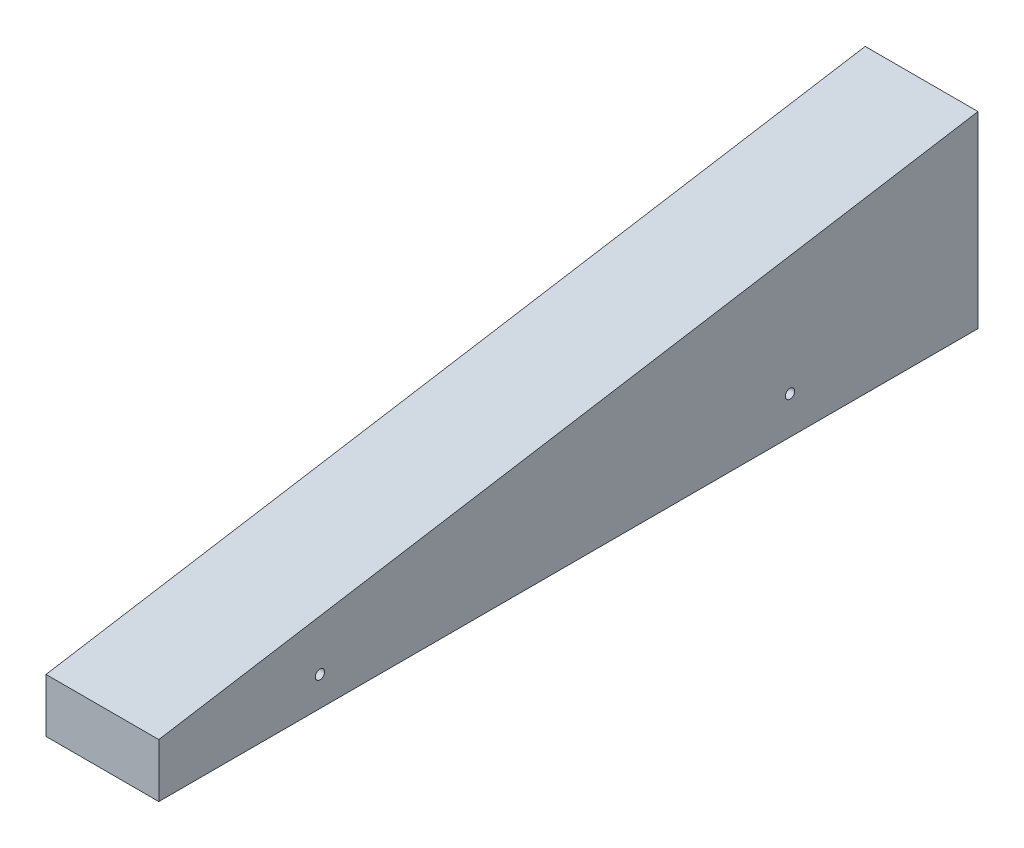
ISO-10303-21;
HEADER;
FILE_DESCRIPTION(('STEP AP214'),'2;1');
FILE_NAME('part.step','',(''),(''),'','','');
FILE_SCHEMA(('AUTOMOTIVE_DESIGN { 1 0 10303 214 1 1 1 1 }'));
ENDSEC;
DATA;
#1=APPLICATION_CONTEXT('core data for automotive mechanical design processes');
#2=APPLICATION_PROTOCOL_DEFINITION('international standard','automotive_design',2000,#1);
#3=PRODUCT_CONTEXT('',#1,'mechanical');
#4=PRODUCT('Part','Part','',(#3));
#5=PRODUCT_RELATED_PRODUCT_CATEGORY('part','',(#4));
#6=PRODUCT_DEFINITION_FORMATION('','',#4);
#7=PRODUCT_DEFINITION_CONTEXT('part definition',#1,'design');
#8=PRODUCT_DEFINITION('design','',#6,#7);
#9=PRODUCT_DEFINITION_SHAPE('','',#8);
#10=(LENGTH_UNIT() NAMED_UNIT(*) SI_UNIT(.MILLI.,.METRE.));
#11=(NAMED_UNIT(*) PLANE_ANGLE_UNIT() SI_UNIT($,.RADIAN.));
#12=(NAMED_UNIT(*) SI_UNIT($,.STERADIAN.) SOLID_ANGLE_UNIT());
#13=UNCERTAINTY_MEASURE_WITH_UNIT(LENGTH_MEASURE(1.E-05),#10,'distance_accuracy_value','');
#14=(GEOMETRIC_REPRESENTATION_CONTEXT(3) GLOBAL_UNCERTAINTY_ASSIGNED_CONTEXT((#13)) GLOBAL_UNIT_ASSIGNED_CONTEXT((#10,
#11,#12)) REPRESENTATION_CONTEXT('',''));
#15=CARTESIAN_POINT('',(0.,0.,0.));
#16=DIRECTION('',(0.,0.,1.));
#17=DIRECTION('',(1.,0.,0.));
#18=AXIS2_PLACEMENT_3D('',#15,#16,#17);
#19=CARTESIAN_POINT('',(21.,0.,152.5));
#20=DIRECTION('',(0.,0.,-1.));
#21=DIRECTION('',(-1.,0.,0.));
#22=AXIS2_PLACEMENT_3D('',#19,#20,#21);
#23=PLANE('',#22);
#24=DIRECTION('',(0.,-1.,0.));
#25=VECTOR('',#24,1.);
#26=CARTESIAN_POINT('',(-21.,0.,152.5));
#27=LINE('',#26,#25);
#28=CARTESIAN_POINT('',(-21.,20.,152.5));
#29=VERTEX_POINT('',#28);
#30=CARTESIAN_POINT('',(-21.,0.,152.5));
#31=VERTEX_POINT('',#30);
#32=EDGE_CURVE('E95',#29,#31,#27,.T.);
#33=ORIENTED_EDGE('',*,*,#32,.T.);
#34=DIRECTION('',(-1.,0.,0.));
#35=VECTOR('',#34,1.);
#36=CARTESIAN_POINT('',(21.,0.,152.5));
#37=LINE('',#36,#35);
#38=CARTESIAN_POINT('',(21.,0.,152.5));
#39=VERTEX_POINT('',#38);
#40=EDGE_CURVE('E11',#39,#31,#37,.T.);
#41=ORIENTED_EDGE('',*,*,#40,.F.);
#42=DIRECTION('',(0.,-1.,0.));
#43=VECTOR('',#42,1.);
#44=CARTESIAN_POINT('',(21.,0.,152.5));
#45=LINE('',#44,#43);
#46=CARTESIAN_POINT('',(21.,20.,152.5));
#47=VERTEX_POINT('',#46);
#48=EDGE_CURVE('E83',#47,#39,#45,.T.);
#49=ORIENTED_EDGE('',*,*,#48,.F.);
#50=DIRECTION('',(-1.,0.,0.));
#51=VECTOR('',#50,1.);
#52=CARTESIAN_POINT('',(21.,20.,152.5));
#53=LINE('',#52,#51);
#54=EDGE_CURVE('E91',#47,#29,#53,.T.);
#55=ORIENTED_EDGE('',*,*,#54,.T.);
#56=EDGE_LOOP('',(#33,#41,#49,#55));
#57=FACE_BOUND('',#56,.T.);
#58=ADVANCED_FACE('F32',(#57),#23,.F.);
#59=CARTESIAN_POINT('',(21.,0.,152.5));
#60=DIRECTION('',(0.,1.,0.));
#61=DIRECTION('',(0.,0.,1.));
#62=AXIS2_PLACEMENT_3D('',#59,#60,#61);
#63=PLANE('',#62);
#64=DIRECTION('',(0.,0.,-1.));
#65=VECTOR('',#64,1.);
#66=CARTESIAN_POINT('',(-21.,0.,152.5));
#67=LINE('',#66,#65);
#68=CARTESIAN_POINT('',(-21.,0.,-152.5));
#69=VERTEX_POINT('',#68);
#70=EDGE_CURVE('E87',#31,#69,#67,.T.);
#71=ORIENTED_EDGE('',*,*,#70,.T.);
#72=DIRECTION('',(-1.,0.,0.));
#73=VECTOR('',#72,1.);
#74=CARTESIAN_POINT('',(21.,0.,-152.5));
#75=LINE('',#74,#73);
#76=CARTESIAN_POINT('',(21.,0.,-152.5));
#77=VERTEX_POINT('',#76);
#78=EDGE_CURVE('E40',#77,#69,#75,.T.);
#79=ORIENTED_EDGE('',*,*,#78,.F.);
#80=DIRECTION('',(0.,0.,-1.));
#81=VECTOR('',#80,1.);
#82=CARTESIAN_POINT('',(21.,0.,152.5));
#83=LINE('',#82,#81);
#84=EDGE_CURVE('E78',#39,#77,#83,.T.);
#85=ORIENTED_EDGE('',*,*,#84,.F.);
#86=ORIENTED_EDGE('',*,*,#40,.T.);
#87=EDGE_LOOP('',(#71,#79,#85,#86));
#88=FACE_BOUND('',#87,.T.);
#89=ADVANCED_FACE('F86',(#88),#63,.F.);
#90=CARTESIAN_POINT('',(21.,0.,-152.5));
#91=DIRECTION('',(0.,0.,1.));
#92=DIRECTION('',(1.,0.,0.));
#93=AXIS2_PLACEMENT_3D('',#90,#91,#92);
#94=PLANE('',#93);
#95=CARTESIAN_POINT('',(0.,32.,-152.5));
#96=DIRECTION('',(0.,0.,-1.));
#97=DIRECTION('',(-1.,0.,0.));
#98=AXIS2_PLACEMENT_3D('',#95,#96,#97);
#99=CIRCLE('',#98,10.);
#100=CARTESIAN_POINT('',(-10.,32.,-152.5));
#101=VERTEX_POINT('',#100);
#102=EDGE_CURVE('E109',#101,#101,#99,.T.);
#103=ORIENTED_EDGE('',*,*,#102,.F.);
#104=EDGE_LOOP('',(#103));
#105=FACE_BOUND('',#104,.T.);
#106=DIRECTION('',(0.,1.,0.));
#107=VECTOR('',#106,1.);
#108=CARTESIAN_POINT('',(-21.,0.,-152.5));
#109=LINE('',#108,#107);
#110=CARTESIAN_POINT('',(-21.,70.,-152.5));
#111=VERTEX_POINT('',#110);
#112=EDGE_CURVE('E65',#69,#111,#109,.T.);
#113=ORIENTED_EDGE('',*,*,#112,.T.);
#114=DIRECTION('',(-1.,0.,0.));
#115=VECTOR('',#114,1.);
#116=CARTESIAN_POINT('',(21.,70.,-152.5));
#117=LINE('',#116,#115);
#118=CARTESIAN_POINT('',(21.,70.,-152.5));
#119=VERTEX_POINT('',#118);
#120=EDGE_CURVE('E88',#119,#111,#117,.T.);
#121=ORIENTED_EDGE('',*,*,#120,.F.);
#122=DIRECTION('',(0.,1.,0.));
#123=VECTOR('',#122,1.);
#124=CARTESIAN_POINT('',(21.,0.,-152.5));
#125=LINE('',#124,#123);
#126=EDGE_CURVE('E81',#77,#119,#125,.T.);
#127=ORIENTED_EDGE('',*,*,#126,.F.);
#128=ORIENTED_EDGE('',*,*,#78,.T.);
#129=EDGE_LOOP('',(#113,#121,#127,#128));
#130=FACE_BOUND('',#129,.T.);
#131=ADVANCED_FACE('F89',(#105,#130),#94,.F.);
#132=CARTESIAN_POINT('',(21.,20.,152.5));
#133=DIRECTION('',(0.,-0.986827665105534,-0.161775027066481));
#134=DIRECTION('',(0.,0.161775027066481,-0.986827665105534));
#135=AXIS2_PLACEMENT_3D('',#132,#133,#134);
#136=PLANE('',#135);
#137=DIRECTION('',(0.,-0.161775027066481,0.986827665105534));
#138=VECTOR('',#137,1.);
#139=CARTESIAN_POINT('',(-21.,20.,152.5));
#140=LINE('',#139,#138);
#141=EDGE_CURVE('E71',#111,#29,#140,.T.);
#142=ORIENTED_EDGE('',*,*,#141,.T.);
#143=ORIENTED_EDGE('',*,*,#54,.F.);
#144=DIRECTION('',(0.,-0.161775027066481,0.986827665105534));
#145=VECTOR('',#144,1.);
#146=CARTESIAN_POINT('',(21.,20.,152.5));
#147=LINE('',#146,#145);
#148=EDGE_CURVE('E48',#119,#47,#147,.T.);
#149=ORIENTED_EDGE('',*,*,#148,.F.);
#150=ORIENTED_EDGE('',*,*,#120,.T.);
#151=EDGE_LOOP('',(#142,#143,#149,#150));
#152=FACE_BOUND('',#151,.T.);
#153=ADVANCED_FACE('F103',(#152),#136,.F.);
#154=CARTESIAN_POINT('',(21.,0.,152.5));
#155=DIRECTION('',(-1.,0.,0.));
#156=DIRECTION('',(0.,0.,1.));
#157=AXIS2_PLACEMENT_3D('',#154,#155,#156);
#158=PLANE('',#157);
#159=CARTESIAN_POINT('',(21.,14.,-82.5));
#160=DIRECTION('',(1.,0.,0.));
#161=DIRECTION('',(0.,0.,-1.));
#162=AXIS2_PLACEMENT_3D('',#159,#160,#161);
#163=CIRCLE('',#162,1.75);
#164=CARTESIAN_POINT('',(21.,14.,-84.25));
#165=VERTEX_POINT('',#164);
#166=EDGE_CURVE('E123',#165,#165,#163,.T.);
#167=ORIENTED_EDGE('',*,*,#166,.F.);
#168=EDGE_LOOP('',(#167));
#169=FACE_BOUND('',#168,.T.);
#170=CARTESIAN_POINT('',(21.,11.,92.5));
#171=DIRECTION('',(1.,0.,0.));
#172=DIRECTION('',(0.,0.,-1.));
#173=AXIS2_PLACEMENT_3D('',#170,#171,#172);
#174=CIRCLE('',#173,1.75);
#175=CARTESIAN_POINT('',(21.,11.,90.75));
#176=VERTEX_POINT('',#175);
#177=EDGE_CURVE('E117',#176,#176,#174,.T.);
#178=ORIENTED_EDGE('',*,*,#177,.F.);
#179=EDGE_LOOP('',(#178));
#180=FACE_BOUND('',#179,.T.);
#181=ORIENTED_EDGE('',*,*,#48,.T.);
#182=ORIENTED_EDGE('',*,*,#84,.T.);
#183=ORIENTED_EDGE('',*,*,#126,.T.);
#184=ORIENTED_EDGE('',*,*,#148,.T.);
#185=EDGE_LOOP('',(#181,#182,#183,#184));
#186=FACE_BOUND('',#185,.T.);
#187=ADVANCED_FACE('F79',(#169,#180,#186),#158,.F.);
#188=CARTESIAN_POINT('',(-21.,0.,152.5));
#189=DIRECTION('',(-1.,0.,0.));
#190=DIRECTION('',(0.,0.,1.));
#191=AXIS2_PLACEMENT_3D('',#188,#189,#190);
#192=PLANE('',#191);
#193=CARTESIAN_POINT('',(-21.,14.,-82.5));
#194=DIRECTION('',(1.,0.,0.));
#195=DIRECTION('',(0.,0.,-1.));
#196=AXIS2_PLACEMENT_3D('',#193,#194,#195);
#197=CIRCLE('',#196,1.75);
#198=CARTESIAN_POINT('',(-21.,14.,-84.25));
#199=VERTEX_POINT('',#198);
#200=EDGE_CURVE('E120',#199,#199,#197,.T.);
#201=ORIENTED_EDGE('',*,*,#200,.T.);
#202=EDGE_LOOP('',(#201));
#203=FACE_BOUND('',#202,.T.);
#204=CARTESIAN_POINT('',(-21.,11.,92.5));
#205=DIRECTION('',(1.,0.,0.));
#206=DIRECTION('',(0.,0.,-1.));
#207=AXIS2_PLACEMENT_3D('',#204,#205,#206);
#208=CIRCLE('',#207,1.75);
#209=CARTESIAN_POINT('',(-21.,11.,90.75));
#210=VERTEX_POINT('',#209);
#211=EDGE_CURVE('E112',#210,#210,#208,.T.);
#212=ORIENTED_EDGE('',*,*,#211,.T.);
#213=EDGE_LOOP('',(#212));
#214=FACE_BOUND('',#213,.T.);
#215=ORIENTED_EDGE('',*,*,#32,.F.);
#216=ORIENTED_EDGE('',*,*,#141,.F.);
#217=ORIENTED_EDGE('',*,*,#112,.F.);
#218=ORIENTED_EDGE('',*,*,#70,.F.);
#219=EDGE_LOOP('',(#215,#216,#217,#218));
#220=FACE_BOUND('',#219,.T.);
#221=ADVANCED_FACE('F106',(#203,#214,#220),#192,.T.);
#222=CARTESIAN_POINT('',(0.,32.,-101.5));
#223=DIRECTION('',(0.,0.,-1.));
#224=DIRECTION('',(-1.,0.,0.));
#225=AXIS2_PLACEMENT_3D('',#222,#223,#224);
#226=CYLINDRICAL_SURFACE('',#225,10.);
#227=CARTESIAN_POINT('',(0.,32.,-101.5));
#228=DIRECTION('',(0.,0.,-1.));
#229=DIRECTION('',(-1.,0.,0.));
#230=AXIS2_PLACEMENT_3D('',#227,#228,#229);
#231=CIRCLE('',#230,10.);
#232=CARTESIAN_POINT('',(-10.,32.,-101.5));
#233=VERTEX_POINT('',#232);
#234=EDGE_CURVE('E98',#233,#233,#231,.T.);
#235=ORIENTED_EDGE('',*,*,#234,.F.);
#236=EDGE_LOOP('',(#235));
#237=FACE_BOUND('',#236,.T.);
#238=ORIENTED_EDGE('',*,*,#102,.T.);
#239=EDGE_LOOP('',(#238));
#240=FACE_BOUND('',#239,.T.);
#241=ADVANCED_FACE('F145',(#237,#240),#226,.F.);
#242=CARTESIAN_POINT('',(0.,32.,-101.5));
#243=DIRECTION('',(0.,0.,-1.));
#244=DIRECTION('',(-1.,0.,0.));
#245=AXIS2_PLACEMENT_3D('',#242,#243,#244);
#246=PLANE('',#245);
#247=ORIENTED_EDGE('',*,*,#234,.T.);
#248=EDGE_LOOP('',(#247));
#249=FACE_BOUND('',#248,.T.);
#250=ADVANCED_FACE('F136',(#249),#246,.T.);
#251=CARTESIAN_POINT('',(-21.,11.,92.5));
#252=DIRECTION('',(1.,0.,0.));
#253=DIRECTION('',(0.,0.,-1.));
#254=AXIS2_PLACEMENT_3D('',#251,#252,#253);
#255=CYLINDRICAL_SURFACE('',#254,1.75);
#256=CARTESIAN_POINT('',(-21.,11.,90.75));
#257=CARTESIAN_POINT('',(-20.5625,11.,90.75));
#258=CARTESIAN_POINT('',(-20.125,11.,90.75));
#259=CARTESIAN_POINT('',(-19.25,11.,90.75));
#260=CARTESIAN_POINT('',(-18.8125,11.,90.75));
#261=CARTESIAN_POINT('',(-17.9375,11.,90.75));
#262=CARTESIAN_POINT('',(-17.5,11.,90.75));
#263=CARTESIAN_POINT('',(-16.625,11.,90.75));
#264=CARTESIAN_POINT('',(-16.1875,11.,90.75));
#265=CARTESIAN_POINT('',(-15.3125,11.,90.75));
#266=CARTESIAN_POINT('',(-14.875,11.,90.75));
#267=CARTESIAN_POINT('',(-14.,11.,90.75));
#268=CARTESIAN_POINT('',(-13.5625,11.,90.75));
#269=CARTESIAN_POINT('',(-12.6875,11.,90.75));
#270=CARTESIAN_POINT('',(-12.25,11.,90.75));
#271=CARTESIAN_POINT('',(-11.375,11.,90.75));
#272=CARTESIAN_POINT('',(-10.9375,11.,90.75));
#273=CARTESIAN_POINT('',(-10.0625,11.,90.75));
#274=CARTESIAN_POINT('',(-9.625,11.,90.75));
#275=CARTESIAN_POINT('',(-8.75,11.,90.75));
#276=CARTESIAN_POINT('',(-8.3125,11.,90.75));
#277=CARTESIAN_POINT('',(-7.4375,11.,90.75));
#278=CARTESIAN_POINT('',(-7.,11.,90.75));
#279=CARTESIAN_POINT('',(-6.125,11.,90.75));
#280=CARTESIAN_POINT('',(-5.6875,11.,90.75));
#281=CARTESIAN_POINT('',(-4.8125,11.,90.75));
#282=CARTESIAN_POINT('',(-4.375,11.,90.75));
#283=CARTESIAN_POINT('',(-3.5,11.,90.75));
#284=CARTESIAN_POINT('',(-3.0625,11.,90.75));
#285=CARTESIAN_POINT('',(-2.1875,11.,90.75));
#286=CARTESIAN_POINT('',(-1.75,11.,90.75));
#287=CARTESIAN_POINT('',(-0.875000000000001,11.,90.75));
#288=CARTESIAN_POINT('',(-0.4375,11.,90.75));
#289=CARTESIAN_POINT('',(0.4375,11.,90.75));
#290=CARTESIAN_POINT('',(0.875000000000001,11.,90.75));
#291=CARTESIAN_POINT('',(1.75,11.,90.75));
#292=CARTESIAN_POINT('',(2.1875,11.,90.75));
#293=CARTESIAN_POINT('',(3.0625,11.,90.75));
#294=CARTESIAN_POINT('',(3.5,11.,90.75));
#295=CARTESIAN_POINT('',(4.375,11.,90.75));
#296=CARTESIAN_POINT('',(4.8125,11.,90.75));
#297=CARTESIAN_POINT('',(5.6875,11.,90.75));
#298=CARTESIAN_POINT('',(6.125,11.,90.75));
#299=CARTESIAN_POINT('',(7.,11.,90.75));
#300=CARTESIAN_POINT('',(7.4375,11.,90.75));
#301=CARTESIAN_POINT('',(8.3125,11.,90.75));
#302=CARTESIAN_POINT('',(8.75,11.,90.75));
#303=CARTESIAN_POINT('',(9.625,11.,90.75));
#304=CARTESIAN_POINT('',(10.0625,11.,90.75));
#305=CARTESIAN_POINT('',(10.9375,11.,90.75));
#306=CARTESIAN_POINT('',(11.375,11.,90.75));
#307=CARTESIAN_POINT('',(12.25,11.,90.75));
#308=CARTESIAN_POINT('',(12.6875,11.,90.75));
#309=CARTESIAN_POINT('',(13.5625,11.,90.75));
#310=CARTESIAN_POINT('',(14.,11.,90.75));
#311=CARTESIAN_POINT('',(14.875,11.,90.75));
#312=CARTESIAN_POINT('',(15.3125,11.,90.75));
#313=CARTESIAN_POINT('',(16.1875,11.,90.75));
#314=CARTESIAN_POINT('',(16.625,11.,90.75));
#315=CARTESIAN_POINT('',(17.5,11.,90.75));
#316=CARTESIAN_POINT('',(17.9375,11.,90.75));
#317=CARTESIAN_POINT('',(18.8125,11.,90.75));
#318=CARTESIAN_POINT('',(19.25,11.,90.75));
#319=CARTESIAN_POINT('',(20.125,11.,90.75));
#320=CARTESIAN_POINT('',(20.5625,11.,90.75));
#321=CARTESIAN_POINT('',(21.,11.,90.75));
#322=B_SPLINE_CURVE_WITH_KNOTS('',3,(#256,#257,#258,#259,#260,#261,#262,#263,#264,#265,#266,
#267,#268,#269,#270,#271,#272,#273,#274,#275,#276,#277,#278,#279,#280,#281,#282,#283,#284,#285,
#286,#287,#288,#289,#290,#291,#292,#293,#294,#295,#296,#297,#298,#299,#300,#301,#302,#303,#304,
#305,#306,#307,#308,#309,#310,#311,#312,#313,#314,#315,#316,#317,#318,#319,#320,#321),
.UNSPECIFIED.,.F.,.F.,(4,2,2,2,2,2,2,2,2,2,2,2,2,2,2,2,2,2,2,2,2,2,2,2,2,2,2,2,2,2,2,2,4),(0.,
1.3125,2.625,3.9375,5.25,6.5625,7.875,9.1875,10.5,11.8125,13.125,14.4375,15.75,17.0625,18.375,
19.6875,21.,22.3125,23.625,24.9375,26.25,27.5625,28.875,30.1875,31.5,32.8125,34.125,35.4375,
36.75,38.0625,39.375,40.6875,42.),.UNSPECIFIED.);
#323=EDGE_CURVE('BSEAM134',#210,#176,#322,.T.);
#324=ORIENTED_EDGE('',*,*,#211,.F.);
#325=ORIENTED_EDGE('',*,*,#177,.T.);
#326=ORIENTED_EDGE('',*,*,#323,.T.);
#327=ORIENTED_EDGE('',*,*,#323,.F.);
#328=EDGE_LOOP('',(#324,#326,#325,#327));
#329=FACE_BOUND('',#328,.T.);
#330=ADVANCED_FACE('F134',(#329),#255,.F.);
#331=CARTESIAN_POINT('',(-21.,14.,-82.5));
#332=DIRECTION('',(1.,0.,0.));
#333=DIRECTION('',(0.,0.,-1.));
#334=AXIS2_PLACEMENT_3D('',#331,#332,#333);
#335=CYLINDRICAL_SURFACE('',#334,1.75);
#336=CARTESIAN_POINT('',(-21.,14.,-84.25));
#337=CARTESIAN_POINT('',(-20.5625,14.,-84.25));
#338=CARTESIAN_POINT('',(-20.125,14.,-84.25));
#339=CARTESIAN_POINT('',(-19.25,14.,-84.25));
#340=CARTESIAN_POINT('',(-18.8125,14.,-84.25));
#341=CARTESIAN_POINT('',(-17.9375,14.,-84.25));
#342=CARTESIAN_POINT('',(-17.5,14.,-84.25));
#343=CARTESIAN_POINT('',(-16.625,14.,-84.25));
#344=CARTESIAN_POINT('',(-16.1875,14.,-84.25));
#345=CARTESIAN_POINT('',(-15.3125,14.,-84.25));
#346=CARTESIAN_POINT('',(-14.875,14.,-84.25));
#347=CARTESIAN_POINT('',(-14.,14.,-84.25));
#348=CARTESIAN_POINT('',(-13.5625,14.,-84.25));
#349=CARTESIAN_POINT('',(-12.6875,14.,-84.25));
#350=CARTESIAN_POINT('',(-12.25,14.,-84.25));
#351=CARTESIAN_POINT('',(-11.375,14.,-84.25));
#352=CARTESIAN_POINT('',(-10.9375,14.,-84.25));
#353=CARTESIAN_POINT('',(-10.0625,14.,-84.25));
#354=CARTESIAN_POINT('',(-9.625,14.,-84.25));
#355=CARTESIAN_POINT('',(-8.75,14.,-84.25));
#356=CARTESIAN_POINT('',(-8.3125,14.,-84.25));
#357=CARTESIAN_POINT('',(-7.4375,14.,-84.25));
#358=CARTESIAN_POINT('',(-7.,14.,-84.25));
#359=CARTESIAN_POINT('',(-6.125,14.,-84.25));
#360=CARTESIAN_POINT('',(-5.6875,14.,-84.25));
#361=CARTESIAN_POINT('',(-4.8125,14.,-84.25));
#362=CARTESIAN_POINT('',(-4.375,14.,-84.25));
#363=CARTESIAN_POINT('',(-3.5,14.,-84.25));
#364=CARTESIAN_POINT('',(-3.0625,14.,-84.25));
#365=CARTESIAN_POINT('',(-2.1875,14.,-84.25));
#366=CARTESIAN_POINT('',(-1.75,14.,-84.25));
#367=CARTESIAN_POINT('',(-0.875000000000001,14.,-84.25));
#368=CARTESIAN_POINT('',(-0.4375,14.,-84.25));
#369=CARTESIAN_POINT('',(0.4375,14.,-84.25));
#370=CARTESIAN_POINT('',(0.875000000000001,14.,-84.25));
#371=CARTESIAN_POINT('',(1.75,14.,-84.25));
#372=CARTESIAN_POINT('',(2.1875,14.,-84.25));
#373=CARTESIAN_POINT('',(3.0625,14.,-84.25));
#374=CARTESIAN_POINT('',(3.5,14.,-84.25));
#375=CARTESIAN_POINT('',(4.375,14.,-84.25));
#376=CARTESIAN_POINT('',(4.8125,14.,-84.25));
#377=CARTESIAN_POINT('',(5.6875,14.,-84.25));
#378=CARTESIAN_POINT('',(6.125,14.,-84.25));
#379=CARTESIAN_POINT('',(7.,14.,-84.25));
#380=CARTESIAN_POINT('',(7.4375,14.,-84.25));
#381=CARTESIAN_POINT('',(8.3125,14.,-84.25));
#382=CARTESIAN_POINT('',(8.75,14.,-84.25));
#383=CARTESIAN_POINT('',(9.625,14.,-84.25));
#384=CARTESIAN_POINT('',(10.0625,14.,-84.25));
#385=CARTESIAN_POINT('',(10.9375,14.,-84.25));
#386=CARTESIAN_POINT('',(11.375,14.,-84.25));
#387=CARTESIAN_POINT('',(12.25,14.,-84.25));
#388=CARTESIAN_POINT('',(12.6875,14.,-84.25));
#389=CARTESIAN_POINT('',(13.5625,14.,-84.25));
#390=CARTESIAN_POINT('',(14.,14.,-84.25));
#391=CARTESIAN_POINT('',(14.875,14.,-84.25));
#392=CARTESIAN_POINT('',(15.3125,14.,-84.25));
#393=CARTESIAN_POINT('',(16.1875,14.,-84.25));
#394=CARTESIAN_POINT('',(16.625,14.,-84.25));
#395=CARTESIAN_POINT('',(17.5,14.,-84.25));
#396=CARTESIAN_POINT('',(17.9375,14.,-84.25));
#397=CARTESIAN_POINT('',(18.8125,14.,-84.25));
#398=CARTESIAN_POINT('',(19.25,14.,-84.25));
#399=CARTESIAN_POINT('',(20.125,14.,-84.25));
#400=CARTESIAN_POINT('',(20.5625,14.,-84.25));
#401=CARTESIAN_POINT('',(21.,14.,-84.25));
#402=B_SPLINE_CURVE_WITH_KNOTS('',3,(#336,#337,#338,#339,#340,#341,#342,#343,#344,#345,#346,
#347,#348,#349,#350,#351,#352,#353,#354,#355,#356,#357,#358,#359,#360,#361,#362,#363,#364,#365,
#366,#367,#368,#369,#370,#371,#372,#373,#374,#375,#376,#377,#378,#379,#380,#381,#382,#383,#384,
#385,#386,#387,#388,#389,#390,#391,#392,#393,#394,#395,#396,#397,#398,#399,#400,#401),
.UNSPECIFIED.,.F.,.F.,(4,2,2,2,2,2,2,2,2,2,2,2,2,2,2,2,2,2,2,2,2,2,2,2,2,2,2,2,2,2,2,2,4),(0.,
1.3125,2.625,3.9375,5.25,6.5625,7.875,9.1875,10.5,11.8125,13.125,14.4375,15.75,17.0625,18.375,
19.6875,21.,22.3125,23.625,24.9375,26.25,27.5625,28.875,30.1875,31.5,32.8125,34.125,35.4375,
36.75,38.0625,39.375,40.6875,42.),.UNSPECIFIED.);
#403=EDGE_CURVE('BSEAM127',#199,#165,#402,.T.);
#404=ORIENTED_EDGE('',*,*,#200,.F.);
#405=ORIENTED_EDGE('',*,*,#166,.T.);
#406=ORIENTED_EDGE('',*,*,#403,.T.);
#407=ORIENTED_EDGE('',*,*,#403,.F.);
#408=EDGE_LOOP('',(#404,#406,#405,#407));
#409=FACE_BOUND('',#408,.T.);
#410=ADVANCED_FACE('F127',(#409),#335,.F.);
#411=CLOSED_SHELL('',(#58,#89,#131,#153,#187,#221,#241,#250,#330,#410));
#412=MANIFOLD_SOLID_BREP('B2',#411);
#413=ADVANCED_BREP_SHAPE_REPRESENTATION('',(#18,#412),#14);
#414=SHAPE_DEFINITION_REPRESENTATION(#9,#413);
ENDSEC;
END-ISO-10303-21;
